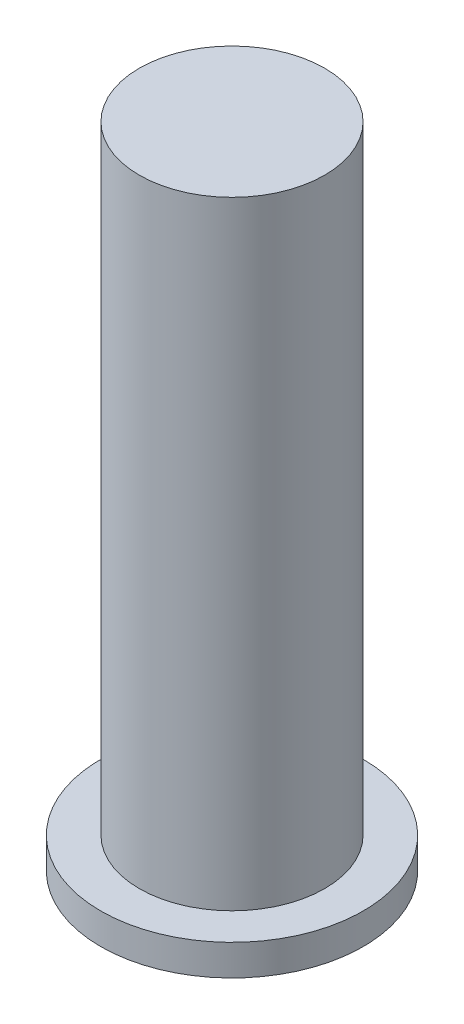
ISO-10303-21;
HEADER;
FILE_DESCRIPTION(('STEP AP214'),'2;1');
FILE_NAME('part.step','',(''),(''),'','','');
FILE_SCHEMA(('AUTOMOTIVE_DESIGN { 1 0 10303 214 1 1 1 1 }'));
ENDSEC;
DATA;
#1=APPLICATION_CONTEXT('core data for automotive mechanical design processes');
#2=APPLICATION_PROTOCOL_DEFINITION('international standard','automotive_design',2000,#1);
#3=PRODUCT_CONTEXT('',#1,'mechanical');
#4=PRODUCT('Part','Part','',(#3));
#5=PRODUCT_RELATED_PRODUCT_CATEGORY('part','',(#4));
#6=PRODUCT_DEFINITION_FORMATION('','',#4);
#7=PRODUCT_DEFINITION_CONTEXT('part definition',#1,'design');
#8=PRODUCT_DEFINITION('design','',#6,#7);
#9=PRODUCT_DEFINITION_SHAPE('','',#8);
#10=(LENGTH_UNIT() NAMED_UNIT(*) SI_UNIT(.MILLI.,.METRE.));
#11=(NAMED_UNIT(*) PLANE_ANGLE_UNIT() SI_UNIT($,.RADIAN.));
#12=(NAMED_UNIT(*) SI_UNIT($,.STERADIAN.) SOLID_ANGLE_UNIT());
#13=UNCERTAINTY_MEASURE_WITH_UNIT(LENGTH_MEASURE(1.E-05),#10,'distance_accuracy_value','');
#14=(GEOMETRIC_REPRESENTATION_CONTEXT(3) GLOBAL_UNCERTAINTY_ASSIGNED_CONTEXT((#13)) GLOBAL_UNIT_ASSIGNED_CONTEXT((#10,
#11,#12)) REPRESENTATION_CONTEXT('',''));
#15=CARTESIAN_POINT('',(0.,0.,0.));
#16=DIRECTION('',(0.,0.,1.));
#17=DIRECTION('',(1.,0.,0.));
#18=AXIS2_PLACEMENT_3D('',#15,#16,#17);
#19=CARTESIAN_POINT('',(-56.2916512459885,125.,0.));
#20=DIRECTION('',(0.,-1.,0.));
#21=DIRECTION('',(0.,0.,1.));
#22=AXIS2_PLACEMENT_3D('',#19,#20,#21);
#23=CYLINDRICAL_SURFACE('',#22,8.50000000000001);
#24=CARTESIAN_POINT('',(-56.2916512459885,125.,0.));
#25=DIRECTION('',(0.,-1.,0.));
#26=DIRECTION('',(0.,0.,-1.));
#27=AXIS2_PLACEMENT_3D('',#24,#25,#26);
#28=CIRCLE('',#27,8.50000000000001);
#29=CARTESIAN_POINT('',(-56.2916512459885,125.,-8.50000000000002));
#30=VERTEX_POINT('',#29);
#31=EDGE_CURVE('E46',#30,#30,#28,.T.);
#32=ORIENTED_EDGE('',*,*,#31,.T.);
#33=EDGE_LOOP('',(#32));
#34=FACE_BOUND('',#33,.T.);
#35=CARTESIAN_POINT('',(-56.2916512459885,123.,0.));
#36=DIRECTION('',(0.,-1.,0.));
#37=DIRECTION('',(0.,0.,-1.));
#38=AXIS2_PLACEMENT_3D('',#35,#36,#37);
#39=CIRCLE('',#38,8.50000000000001);
#40=CARTESIAN_POINT('',(-56.2916512459885,123.,-8.50000000000002));
#41=VERTEX_POINT('',#40);
#42=EDGE_CURVE('E45',#41,#41,#39,.T.);
#43=ORIENTED_EDGE('',*,*,#42,.F.);
#44=EDGE_LOOP('',(#43));
#45=FACE_BOUND('',#44,.T.);
#46=ADVANCED_FACE('F39',(#34,#45),#23,.T.);
#47=CARTESIAN_POINT('',(-56.2916512459885,125.,0.));
#48=DIRECTION('',(0.,1.,0.));
#49=DIRECTION('',(0.,0.,-1.));
#50=AXIS2_PLACEMENT_3D('',#47,#48,#49);
#51=PLANE('',#50);
#52=CARTESIAN_POINT('',(-56.2916512459887,125.,-1.28574312865734E-13));
#53=DIRECTION('',(0.,-1.,0.));
#54=DIRECTION('',(0.,0.,-1.));
#55=AXIS2_PLACEMENT_3D('',#52,#53,#54);
#56=CIRCLE('',#55,5.99999999999997);
#57=CARTESIAN_POINT('',(-56.2916512459887,125.,-6.0000000000001));
#58=VERTEX_POINT('',#57);
#59=EDGE_CURVE('E10',#58,#58,#56,.T.);
#60=ORIENTED_EDGE('',*,*,#59,.T.);
#61=EDGE_LOOP('',(#60));
#62=FACE_BOUND('',#61,.T.);
#63=ORIENTED_EDGE('',*,*,#31,.F.);
#64=EDGE_LOOP('',(#63));
#65=FACE_BOUND('',#64,.T.);
#66=ADVANCED_FACE('F65',(#62,#65),#51,.T.);
#67=CARTESIAN_POINT('',(-56.2916512459885,123.,0.));
#68=DIRECTION('',(0.,1.,0.));
#69=DIRECTION('',(0.,0.,-1.));
#70=AXIS2_PLACEMENT_3D('',#67,#68,#69);
#71=PLANE('',#70);
#72=ORIENTED_EDGE('',*,*,#42,.T.);
#73=EDGE_LOOP('',(#72));
#74=FACE_BOUND('',#73,.T.);
#75=ADVANCED_FACE('F56',(#74),#71,.F.);
#76=CARTESIAN_POINT('',(-56.2916512459887,156.5,-1.28574312865734E-13));
#77=DIRECTION('',(0.,-1.,0.));
#78=DIRECTION('',(0.,0.,1.));
#79=AXIS2_PLACEMENT_3D('',#76,#77,#78);
#80=CYLINDRICAL_SURFACE('',#79,5.99999999999997);
#81=ORIENTED_EDGE('',*,*,#59,.F.);
#82=EDGE_LOOP('',(#81));
#83=FACE_BOUND('',#82,.T.);
#84=CARTESIAN_POINT('',(-56.2916512459886,165.,0.));
#85=DIRECTION('',(0.,-1.,0.));
#86=DIRECTION('',(0.,0.,-1.));
#87=AXIS2_PLACEMENT_3D('',#84,#85,#86);
#88=CIRCLE('',#87,5.99999999999995);
#89=CARTESIAN_POINT('',(-56.2916512459886,165.,-5.99999999999996));
#90=VERTEX_POINT('',#89);
#91=EDGE_CURVE('E55',#90,#90,#88,.T.);
#92=ORIENTED_EDGE('',*,*,#91,.T.);
#93=EDGE_LOOP('',(#92));
#94=FACE_BOUND('',#93,.T.);
#95=ADVANCED_FACE('F71',(#83,#94),#80,.T.);
#96=CARTESIAN_POINT('',(-56.2916512459886,165.,0.));
#97=DIRECTION('',(0.,1.,0.));
#98=DIRECTION('',(0.,0.,-1.));
#99=AXIS2_PLACEMENT_3D('',#96,#97,#98);
#100=PLANE('',#99);
#101=ORIENTED_EDGE('',*,*,#91,.F.);
#102=EDGE_LOOP('',(#101));
#103=FACE_BOUND('',#102,.T.);
#104=ADVANCED_FACE('F80',(#103),#100,.T.);
#105=CLOSED_SHELL('',(#46,#66,#75,#95,#104));
#106=MANIFOLD_SOLID_BREP('B2',#105);
#107=ADVANCED_BREP_SHAPE_REPRESENTATION('',(#18,#106),#14);
#108=SHAPE_DEFINITION_REPRESENTATION(#9,#107);
ENDSEC;
END-ISO-10303-21;
